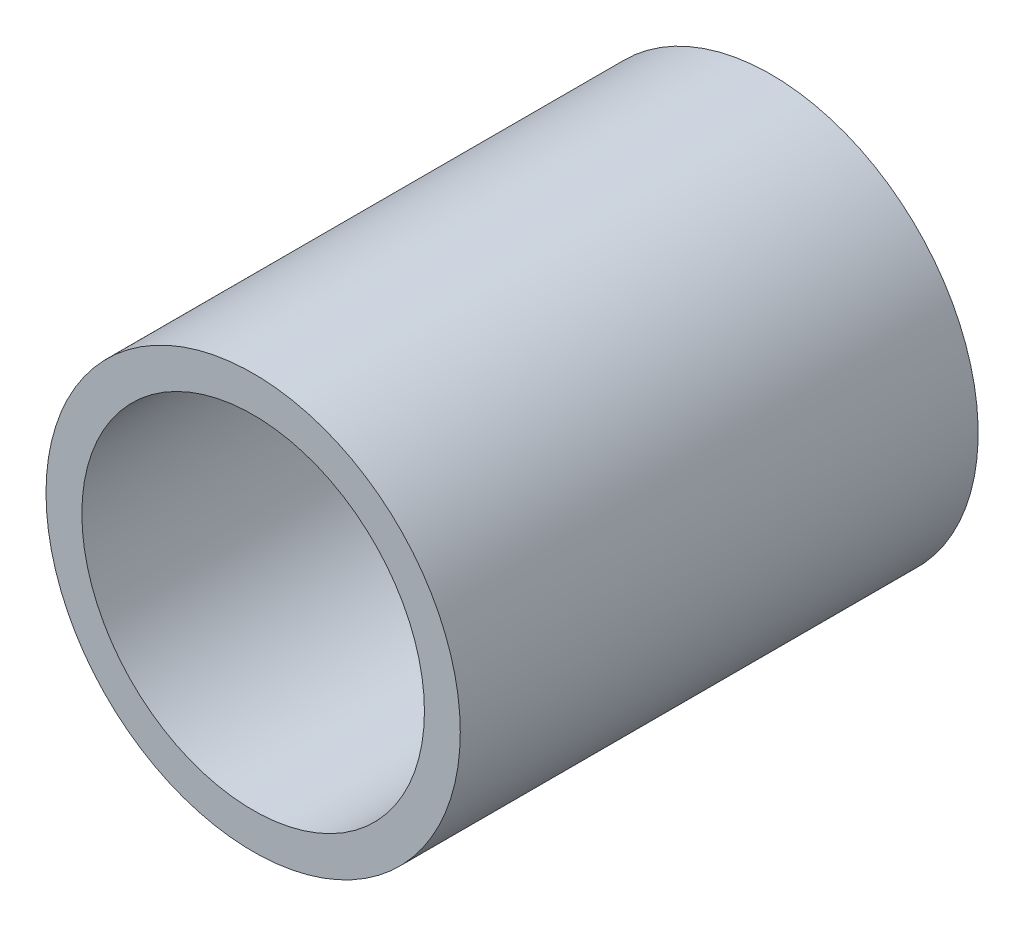
ISO-10303-21;
HEADER;
FILE_DESCRIPTION(('STEP AP214'),'2;1');
FILE_NAME('part.step','',(''),(''),'','','');
FILE_SCHEMA(('AUTOMOTIVE_DESIGN { 1 0 10303 214 1 1 1 1 }'));
ENDSEC;
DATA;
#1=APPLICATION_CONTEXT('core data for automotive mechanical design processes');
#2=APPLICATION_PROTOCOL_DEFINITION('international standard','automotive_design',2000,#1);
#3=PRODUCT_CONTEXT('',#1,'mechanical');
#4=PRODUCT('Part','Part','',(#3));
#5=PRODUCT_RELATED_PRODUCT_CATEGORY('part','',(#4));
#6=PRODUCT_DEFINITION_FORMATION('','',#4);
#7=PRODUCT_DEFINITION_CONTEXT('part definition',#1,'design');
#8=PRODUCT_DEFINITION('design','',#6,#7);
#9=PRODUCT_DEFINITION_SHAPE('','',#8);
#10=(LENGTH_UNIT() NAMED_UNIT(*) SI_UNIT(.MILLI.,.METRE.));
#11=(NAMED_UNIT(*) PLANE_ANGLE_UNIT() SI_UNIT($,.RADIAN.));
#12=(NAMED_UNIT(*) SI_UNIT($,.STERADIAN.) SOLID_ANGLE_UNIT());
#13=UNCERTAINTY_MEASURE_WITH_UNIT(LENGTH_MEASURE(1.E-05),#10,'distance_accuracy_value','');
#14=(GEOMETRIC_REPRESENTATION_CONTEXT(3) GLOBAL_UNCERTAINTY_ASSIGNED_CONTEXT((#13)) GLOBAL_UNIT_ASSIGNED_CONTEXT((#10,
#11,#12)) REPRESENTATION_CONTEXT('',''));
#15=CARTESIAN_POINT('',(0.,0.,0.));
#16=DIRECTION('',(0.,0.,1.));
#17=DIRECTION('',(1.,0.,0.));
#18=AXIS2_PLACEMENT_3D('',#15,#16,#17);
#19=CARTESIAN_POINT('',(0.,0.,0.));
#20=DIRECTION('',(0.,0.,1.));
#21=DIRECTION('',(1.,0.,0.));
#22=AXIS2_PLACEMENT_3D('',#19,#20,#21);
#23=PLANE('',#22);
#24=CARTESIAN_POINT('',(0.,0.,0.));
#25=DIRECTION('',(0.,0.,-1.));
#26=DIRECTION('',(-1.,0.,0.));
#27=AXIS2_PLACEMENT_3D('',#24,#25,#26);
#28=CIRCLE('',#27,1.1);
#29=CARTESIAN_POINT('',(-1.1,0.,0.));
#30=VERTEX_POINT('',#29);
#31=EDGE_CURVE('E41',#30,#30,#28,.T.);
#32=ORIENTED_EDGE('',*,*,#31,.F.);
#33=EDGE_LOOP('',(#32));
#34=FACE_BOUND('',#33,.T.);
#35=CARTESIAN_POINT('',(0.,0.,0.));
#36=DIRECTION('',(0.,0.,-1.));
#37=DIRECTION('',(-1.,0.,0.));
#38=AXIS2_PLACEMENT_3D('',#35,#36,#37);
#39=CIRCLE('',#38,2.15);
#40=CARTESIAN_POINT('',(-2.15,0.,0.));
#41=VERTEX_POINT('',#40);
#42=EDGE_CURVE('E53',#41,#41,#39,.T.);
#43=ORIENTED_EDGE('',*,*,#42,.T.);
#44=EDGE_LOOP('',(#43));
#45=FACE_BOUND('',#44,.T.);
#46=ADVANCED_FACE('F37',(#34,#45),#23,.F.);
#47=CARTESIAN_POINT('',(0.,0.,0.6));
#48=DIRECTION('',(0.,0.,-1.));
#49=DIRECTION('',(-1.,0.,0.));
#50=AXIS2_PLACEMENT_3D('',#47,#48,#49);
#51=CYLINDRICAL_SURFACE('',#50,1.1);
#52=CARTESIAN_POINT('',(0.,0.,0.6));
#53=DIRECTION('',(0.,0.,-1.));
#54=DIRECTION('',(-1.,0.,0.));
#55=AXIS2_PLACEMENT_3D('',#52,#53,#54);
#56=CIRCLE('',#55,1.1);
#57=CARTESIAN_POINT('',(-1.1,0.,0.6));
#58=VERTEX_POINT('',#57);
#59=EDGE_CURVE('E10',#58,#58,#56,.T.);
#60=ORIENTED_EDGE('',*,*,#59,.F.);
#61=EDGE_LOOP('',(#60));
#62=FACE_BOUND('',#61,.T.);
#63=ORIENTED_EDGE('',*,*,#31,.T.);
#64=EDGE_LOOP('',(#63));
#65=FACE_BOUND('',#64,.T.);
#66=ADVANCED_FACE('F93',(#62,#65),#51,.F.);
#67=CARTESIAN_POINT('',(0.,0.,0.6));
#68=DIRECTION('',(0.,0.,-1.));
#69=DIRECTION('',(-1.,0.,0.));
#70=AXIS2_PLACEMENT_3D('',#67,#68,#69);
#71=PLANE('',#70);
#72=ORIENTED_EDGE('',*,*,#59,.T.);
#73=EDGE_LOOP('',(#72));
#74=FACE_BOUND('',#73,.T.);
#75=ADVANCED_FACE('F100',(#74),#71,.T.);
#76=CARTESIAN_POINT('',(0.,0.,-1.));
#77=DIRECTION('',(0.,0.,-1.));
#78=DIRECTION('',(-1.,0.,0.));
#79=AXIS2_PLACEMENT_3D('',#76,#77,#78);
#80=PLANE('',#79);
#81=CARTESIAN_POINT('',(0.,0.,-1.));
#82=DIRECTION('',(0.,0.,-1.));
#83=DIRECTION('',(-1.,0.,0.));
#84=AXIS2_PLACEMENT_3D('',#81,#82,#83);
#85=CIRCLE('',#84,2.6);
#86=CARTESIAN_POINT('',(-2.6,0.,-1.));
#87=VERTEX_POINT('',#86);
#88=EDGE_CURVE('E48',#87,#87,#85,.T.);
#89=ORIENTED_EDGE('',*,*,#88,.T.);
#90=EDGE_LOOP('',(#89));
#91=FACE_BOUND('',#90,.T.);
#92=CARTESIAN_POINT('',(0.,0.,-1.));
#93=DIRECTION('',(0.,0.,-1.));
#94=DIRECTION('',(-1.,0.,0.));
#95=AXIS2_PLACEMENT_3D('',#92,#93,#94);
#96=CIRCLE('',#95,2.15);
#97=CARTESIAN_POINT('',(-2.15,0.,-1.));
#98=VERTEX_POINT('',#97);
#99=EDGE_CURVE('E52',#98,#98,#96,.T.);
#100=ORIENTED_EDGE('',*,*,#99,.F.);
#101=EDGE_LOOP('',(#100));
#102=FACE_BOUND('',#101,.T.);
#103=ADVANCED_FACE('F88',(#91,#102),#80,.T.);
#104=CARTESIAN_POINT('',(0.,0.,-1.));
#105=DIRECTION('',(0.,0.,1.));
#106=DIRECTION('',(1.,0.,0.));
#107=AXIS2_PLACEMENT_3D('',#104,#105,#106);
#108=CYLINDRICAL_SURFACE('',#107,2.15);
#109=ORIENTED_EDGE('',*,*,#99,.T.);
#110=EDGE_LOOP('',(#109));
#111=FACE_BOUND('',#110,.T.);
#112=ORIENTED_EDGE('',*,*,#42,.F.);
#113=EDGE_LOOP('',(#112));
#114=FACE_BOUND('',#113,.T.);
#115=ADVANCED_FACE('F83',(#111,#114),#108,.F.);
#116=CARTESIAN_POINT('',(0.,0.,1.5));
#117=DIRECTION('',(0.,0.,-1.));
#118=DIRECTION('',(-1.,0.,0.));
#119=AXIS2_PLACEMENT_3D('',#116,#117,#118);
#120=CYLINDRICAL_SURFACE('',#119,2.6);
#121=ORIENTED_EDGE('',*,*,#88,.F.);
#122=EDGE_LOOP('',(#121));
#123=FACE_BOUND('',#122,.T.);
#124=CARTESIAN_POINT('',(0.,0.,5.5));
#125=DIRECTION('',(0.,0.,1.));
#126=DIRECTION('',(1.,0.,0.));
#127=AXIS2_PLACEMENT_3D('',#124,#125,#126);
#128=CIRCLE('',#127,2.6);
#129=CARTESIAN_POINT('',(2.6,0.,5.5));
#130=VERTEX_POINT('',#129);
#131=EDGE_CURVE('E56',#130,#130,#128,.T.);
#132=ORIENTED_EDGE('',*,*,#131,.F.);
#133=EDGE_LOOP('',(#132));
#134=FACE_BOUND('',#133,.T.);
#135=ADVANCED_FACE('F39',(#123,#134),#120,.T.);
#136=CARTESIAN_POINT('',(0.,0.,5.5));
#137=DIRECTION('',(0.,0.,1.));
#138=DIRECTION('',(1.,0.,0.));
#139=AXIS2_PLACEMENT_3D('',#136,#137,#138);
#140=PLANE('',#139);
#141=CARTESIAN_POINT('',(0.,0.,5.5));
#142=DIRECTION('',(0.,0.,1.));
#143=DIRECTION('',(1.,0.,0.));
#144=AXIS2_PLACEMENT_3D('',#141,#142,#143);
#145=CIRCLE('',#144,2.15);
#146=CARTESIAN_POINT('',(2.15,0.,5.5));
#147=VERTEX_POINT('',#146);
#148=EDGE_CURVE('E62',#147,#147,#145,.T.);
#149=ORIENTED_EDGE('',*,*,#148,.F.);
#150=EDGE_LOOP('',(#149));
#151=FACE_BOUND('',#150,.T.);
#152=ORIENTED_EDGE('',*,*,#131,.T.);
#153=EDGE_LOOP('',(#152));
#154=FACE_BOUND('',#153,.T.);
#155=ADVANCED_FACE('F73',(#151,#154),#140,.T.);
#156=CARTESIAN_POINT('',(0.,0.,1.4));
#157=DIRECTION('',(0.,0.,1.));
#158=DIRECTION('',(1.,0.,0.));
#159=AXIS2_PLACEMENT_3D('',#156,#157,#158);
#160=CYLINDRICAL_SURFACE('',#159,2.15);
#161=CARTESIAN_POINT('',(0.,0.,1.4));
#162=DIRECTION('',(0.,0.,1.));
#163=DIRECTION('',(1.,0.,0.));
#164=AXIS2_PLACEMENT_3D('',#161,#162,#163);
#165=CIRCLE('',#164,2.15);
#166=CARTESIAN_POINT('',(2.15,0.,1.4));
#167=VERTEX_POINT('',#166);
#168=EDGE_CURVE('E61',#167,#167,#165,.T.);
#169=ORIENTED_EDGE('',*,*,#168,.F.);
#170=EDGE_LOOP('',(#169));
#171=FACE_BOUND('',#170,.T.);
#172=ORIENTED_EDGE('',*,*,#148,.T.);
#173=EDGE_LOOP('',(#172));
#174=FACE_BOUND('',#173,.T.);
#175=ADVANCED_FACE('F70',(#171,#174),#160,.F.);
#176=CARTESIAN_POINT('',(0.,0.,1.4));
#177=DIRECTION('',(0.,0.,1.));
#178=DIRECTION('',(1.,0.,0.));
#179=AXIS2_PLACEMENT_3D('',#176,#177,#178);
#180=PLANE('',#179);
#181=ORIENTED_EDGE('',*,*,#168,.T.);
#182=EDGE_LOOP('',(#181));
#183=FACE_BOUND('',#182,.T.);
#184=ADVANCED_FACE('F68',(#183),#180,.T.);
#185=CLOSED_SHELL('',(#46,#66,#75,#103,#115,#135,#155,#175,#184));
#186=MANIFOLD_SOLID_BREP('B2',#185);
#187=ADVANCED_BREP_SHAPE_REPRESENTATION('',(#18,#186),#14);
#188=SHAPE_DEFINITION_REPRESENTATION(#9,#187);
ENDSEC;
END-ISO-10303-21;
